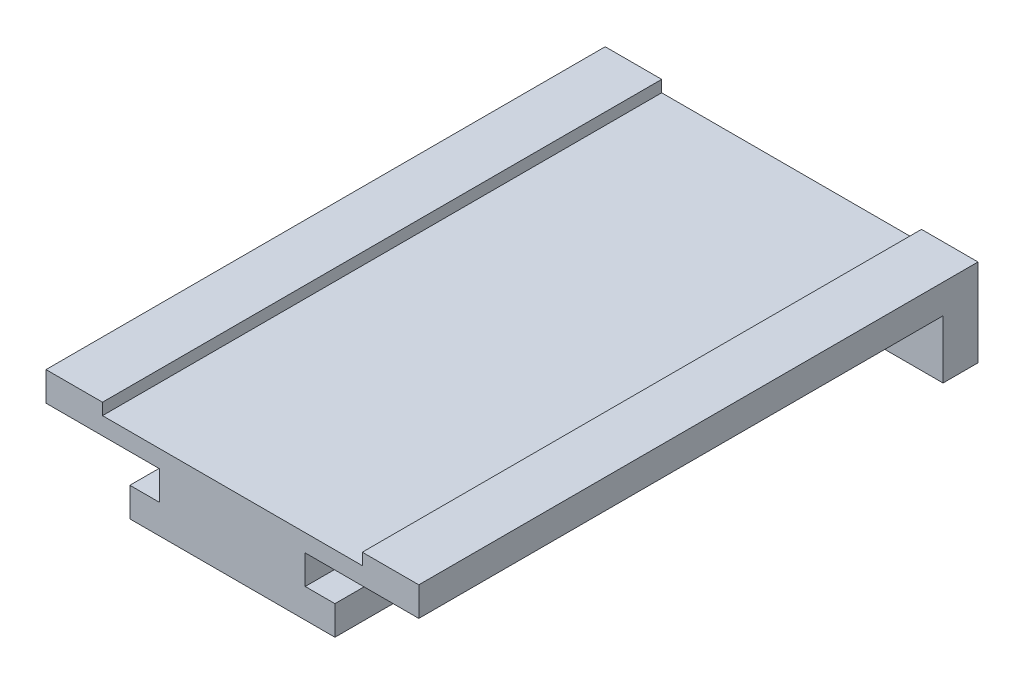
ISO-10303-21;
HEADER;
FILE_DESCRIPTION(('STEP AP214'),'2;1');
FILE_NAME('part.step','',(''),(''),'','','');
FILE_SCHEMA(('AUTOMOTIVE_DESIGN { 1 0 10303 214 1 1 1 1 }'));
ENDSEC;
DATA;
#1=APPLICATION_CONTEXT('core data for automotive mechanical design processes');
#2=APPLICATION_PROTOCOL_DEFINITION('international standard','automotive_design',2000,#1);
#3=PRODUCT_CONTEXT('',#1,'mechanical');
#4=PRODUCT('Part','Part','',(#3));
#5=PRODUCT_RELATED_PRODUCT_CATEGORY('part','',(#4));
#6=PRODUCT_DEFINITION_FORMATION('','',#4);
#7=PRODUCT_DEFINITION_CONTEXT('part definition',#1,'design');
#8=PRODUCT_DEFINITION('design','',#6,#7);
#9=PRODUCT_DEFINITION_SHAPE('','',#8);
#10=(LENGTH_UNIT() NAMED_UNIT(*) SI_UNIT(.MILLI.,.METRE.));
#11=(NAMED_UNIT(*) PLANE_ANGLE_UNIT() SI_UNIT($,.RADIAN.));
#12=(NAMED_UNIT(*) SI_UNIT($,.STERADIAN.) SOLID_ANGLE_UNIT());
#13=UNCERTAINTY_MEASURE_WITH_UNIT(LENGTH_MEASURE(1.E-05),#10,'distance_accuracy_value','');
#14=(GEOMETRIC_REPRESENTATION_CONTEXT(3) GLOBAL_UNCERTAINTY_ASSIGNED_CONTEXT((#13)) GLOBAL_UNIT_ASSIGNED_CONTEXT((#10,
#11,#12)) REPRESENTATION_CONTEXT('',''));
#15=CARTESIAN_POINT('',(0.,0.,0.));
#16=DIRECTION('',(0.,0.,1.));
#17=DIRECTION('',(1.,0.,0.));
#18=AXIS2_PLACEMENT_3D('',#15,#16,#17);
#19=CARTESIAN_POINT('',(0.,2.78985507246377,45.));
#20=DIRECTION('',(0.,1.,0.));
#21=DIRECTION('',(0.,0.,1.));
#22=AXIS2_PLACEMENT_3D('',#19,#20,#21);
#23=PLANE('',#22);
#24=DIRECTION('',(1.,0.,0.));
#25=VECTOR('',#24,1.);
#26=CARTESIAN_POINT('',(12.7971014492753,2.78985507246377,-3.));
#27=LINE('',#26,#25);
#28=CARTESIAN_POINT('',(7.94710144927535,2.78985507246377,-3.));
#29=VERTEX_POINT('',#28);
#30=CARTESIAN_POINT('',(12.7971014492753,2.78985507246377,-3.));
#31=VERTEX_POINT('',#30);
#32=EDGE_CURVE('E169',#29,#31,#27,.T.);
#33=ORIENTED_EDGE('',*,*,#32,.F.);
#34=DIRECTION('',(0.,0.,1.));
#35=VECTOR('',#34,1.);
#36=CARTESIAN_POINT('',(7.94710144927535,2.78985507246377,0.));
#37=LINE('',#36,#35);
#38=CARTESIAN_POINT('',(7.94710144927535,2.78985507246377,45.));
#39=VERTEX_POINT('',#38);
#40=EDGE_CURVE('E324',#29,#39,#37,.T.);
#41=ORIENTED_EDGE('',*,*,#40,.T.);
#42=DIRECTION('',(1.,0.,0.));
#43=VECTOR('',#42,1.);
#44=CARTESIAN_POINT('',(0.,2.78985507246377,45.));
#45=LINE('',#44,#43);
#46=CARTESIAN_POINT('',(12.7971014492753,2.78985507246377,45.));
#47=VERTEX_POINT('',#46);
#48=EDGE_CURVE('E171',#39,#47,#45,.T.);
#49=ORIENTED_EDGE('',*,*,#48,.T.);
#50=DIRECTION('',(0.,0.,-1.));
#51=VECTOR('',#50,1.);
#52=CARTESIAN_POINT('',(12.7971014492753,2.78985507246377,45.));
#53=LINE('',#52,#51);
#54=EDGE_CURVE('E49',#47,#31,#53,.T.);
#55=ORIENTED_EDGE('',*,*,#54,.T.);
#56=EDGE_LOOP('',(#33,#41,#49,#55));
#57=FACE_BOUND('',#56,.T.);
#58=ADVANCED_FACE('F40',(#57),#23,.T.);
#59=CARTESIAN_POINT('',(0.,0.289855072463773,45.));
#60=DIRECTION('',(0.,1.,0.));
#61=DIRECTION('',(0.,0.,1.));
#62=AXIS2_PLACEMENT_3D('',#59,#60,#61);
#63=PLANE('',#62);
#64=DIRECTION('',(1.,0.,0.));
#65=VECTOR('',#64,1.);
#66=CARTESIAN_POINT('',(0.,0.289855072463773,0.));
#67=LINE('',#66,#65);
#68=CARTESIAN_POINT('',(3.04710144927535,0.289855072463773,0.));
#69=VERTEX_POINT('',#68);
#70=CARTESIAN_POINT('',(12.7971014492753,0.289855072463773,0.));
#71=VERTEX_POINT('',#70);
#72=EDGE_CURVE('E141',#69,#71,#67,.T.);
#73=ORIENTED_EDGE('',*,*,#72,.T.);
#74=DIRECTION('',(0.,0.,-1.));
#75=VECTOR('',#74,1.);
#76=CARTESIAN_POINT('',(12.7971014492753,0.289855072463773,45.));
#77=LINE('',#76,#75);
#78=CARTESIAN_POINT('',(12.7971014492753,0.289855072463773,45.));
#79=VERTEX_POINT('',#78);
#80=EDGE_CURVE('E11',#79,#71,#77,.T.);
#81=ORIENTED_EDGE('',*,*,#80,.F.);
#82=DIRECTION('',(1.,0.,0.));
#83=VECTOR('',#82,1.);
#84=CARTESIAN_POINT('',(0.,0.289855072463773,45.));
#85=LINE('',#84,#83);
#86=CARTESIAN_POINT('',(3.04710144927535,0.289855072463773,45.));
#87=VERTEX_POINT('',#86);
#88=EDGE_CURVE('E154',#87,#79,#85,.T.);
#89=ORIENTED_EDGE('',*,*,#88,.F.);
#90=DIRECTION('',(0.,0.,-1.));
#91=VECTOR('',#90,1.);
#92=CARTESIAN_POINT('',(3.04710144927535,0.289855072463773,45.));
#93=LINE('',#92,#91);
#94=EDGE_CURVE('E65',#87,#69,#93,.T.);
#95=ORIENTED_EDGE('',*,*,#94,.T.);
#96=EDGE_LOOP('',(#73,#81,#89,#95));
#97=FACE_BOUND('',#96,.T.);
#98=ADVANCED_FACE('F42',(#97),#63,.F.);
#99=CARTESIAN_POINT('',(12.7971014492753,0.,45.));
#100=DIRECTION('',(-1.,0.,0.));
#101=DIRECTION('',(0.,0.,1.));
#102=AXIS2_PLACEMENT_3D('',#99,#100,#101);
#103=PLANE('',#102);
#104=ORIENTED_EDGE('',*,*,#80,.T.);
#105=DIRECTION('',(0.,-1.,0.));
#106=VECTOR('',#105,1.);
#107=CARTESIAN_POINT('',(12.7971014492753,2.78985507246377,0.));
#108=LINE('',#107,#106);
#109=CARTESIAN_POINT('',(12.7971014492753,-4.71014492753623,0.));
#110=VERTEX_POINT('',#109);
#111=EDGE_CURVE('E208',#71,#110,#108,.T.);
#112=ORIENTED_EDGE('',*,*,#111,.T.);
#113=DIRECTION('',(0.,0.,1.));
#114=VECTOR('',#113,1.);
#115=CARTESIAN_POINT('',(12.7971014492753,-4.71014492753623,-3.));
#116=LINE('',#115,#114);
#117=CARTESIAN_POINT('',(12.7971014492753,-4.71014492753623,-3.));
#118=VERTEX_POINT('',#117);
#119=EDGE_CURVE('E182',#118,#110,#116,.T.);
#120=ORIENTED_EDGE('',*,*,#119,.F.);
#121=DIRECTION('',(0.,-1.,0.));
#122=VECTOR('',#121,1.);
#123=CARTESIAN_POINT('',(12.7971014492753,2.78985507246377,-3.));
#124=LINE('',#123,#122);
#125=EDGE_CURVE('E177',#31,#118,#124,.T.);
#126=ORIENTED_EDGE('',*,*,#125,.F.);
#127=ORIENTED_EDGE('',*,*,#54,.F.);
#128=DIRECTION('',(0.,1.,0.));
#129=VECTOR('',#128,1.);
#130=CARTESIAN_POINT('',(12.7971014492753,0.,45.));
#131=LINE('',#130,#129);
#132=EDGE_CURVE('E93',#79,#47,#131,.T.);
#133=ORIENTED_EDGE('',*,*,#132,.F.);
#134=EDGE_LOOP('',(#104,#112,#120,#126,#127,#133));
#135=FACE_BOUND('',#134,.T.);
#136=ADVANCED_FACE('F178',(#135),#103,.F.);
#137=DIRECTION('',(0.,0.,1.));
#138=VECTOR('',#137,1.);
#139=CARTESIAN_POINT('',(-14.3528985507247,2.78985507246377,0.));
#140=LINE('',#139,#138);
#141=CARTESIAN_POINT('',(-14.3528985507247,2.78985507246377,-3.));
#142=VERTEX_POINT('',#141);
#143=CARTESIAN_POINT('',(-14.3528985507247,2.78985507246377,45.));
#144=VERTEX_POINT('',#143);
#145=EDGE_CURVE('E319',#142,#144,#140,.T.);
#146=ORIENTED_EDGE('',*,*,#145,.F.);
#147=CARTESIAN_POINT('',(-19.2028985507247,2.78985507246377,-3.));
#148=VERTEX_POINT('',#147);
#149=EDGE_CURVE('E203',#148,#142,#27,.T.);
#150=ORIENTED_EDGE('',*,*,#149,.F.);
#151=DIRECTION('',(0.,0.,-1.));
#152=VECTOR('',#151,1.);
#153=CARTESIAN_POINT('',(-19.2028985507247,2.78985507246377,45.));
#154=LINE('',#153,#152);
#155=CARTESIAN_POINT('',(-19.2028985507247,2.78985507246377,45.));
#156=VERTEX_POINT('',#155);
#157=EDGE_CURVE('E268',#156,#148,#154,.T.);
#158=ORIENTED_EDGE('',*,*,#157,.F.);
#159=EDGE_CURVE('E291',#156,#144,#45,.T.);
#160=ORIENTED_EDGE('',*,*,#159,.T.);
#161=EDGE_LOOP('',(#146,#150,#158,#160));
#162=FACE_BOUND('',#161,.T.);
#163=ADVANCED_FACE('F411',(#162),#23,.T.);
#164=CARTESIAN_POINT('',(0.,-4.71014492753623,45.));
#165=DIRECTION('',(0.,1.,0.));
#166=DIRECTION('',(0.,0.,1.));
#167=AXIS2_PLACEMENT_3D('',#164,#165,#166);
#168=PLANE('',#167);
#169=CARTESIAN_POINT('',(-3.20289855072465,-4.71014492753623,32.5));
#170=DIRECTION('',(0.,-1.,0.));
#171=DIRECTION('',(0.,0.,-1.));
#172=AXIS2_PLACEMENT_3D('',#169,#170,#171);
#173=CIRCLE('',#172,1.5);
#174=CARTESIAN_POINT('',(-3.20289855072465,-4.71014492753623,31.));
#175=VERTEX_POINT('',#174);
#176=EDGE_CURVE('E222',#175,#175,#173,.T.);
#177=ORIENTED_EDGE('',*,*,#176,.F.);
#178=EDGE_LOOP('',(#177));
#179=FACE_BOUND('',#178,.T.);
#180=CARTESIAN_POINT('',(-3.20289855072465,-4.71014492753623,12.5));
#181=DIRECTION('',(0.,-1.,0.));
#182=DIRECTION('',(0.,0.,1.));
#183=AXIS2_PLACEMENT_3D('',#180,#181,#182);
#184=CIRCLE('',#183,1.5);
#185=CARTESIAN_POINT('',(-3.20289855072465,-4.71014492753623,14.));
#186=VERTEX_POINT('',#185);
#187=EDGE_CURVE('E221',#186,#186,#184,.T.);
#188=ORIENTED_EDGE('',*,*,#187,.F.);
#189=EDGE_LOOP('',(#188));
#190=FACE_BOUND('',#189,.T.);
#191=DIRECTION('',(0.,0.,-1.));
#192=VECTOR('',#191,1.);
#193=CARTESIAN_POINT('',(-12.0028985507247,-4.71014492753623,45.));
#194=LINE('',#193,#192);
#195=CARTESIAN_POINT('',(-12.0028985507247,-4.71014492753623,45.));
#196=VERTEX_POINT('',#195);
#197=CARTESIAN_POINT('',(-12.0028985507247,-4.71014492753623,0.));
#198=VERTEX_POINT('',#197);
#199=EDGE_CURVE('E272',#196,#198,#194,.T.);
#200=ORIENTED_EDGE('',*,*,#199,.T.);
#201=DIRECTION('',(-1.,0.,0.));
#202=VECTOR('',#201,1.);
#203=CARTESIAN_POINT('',(12.7971014492753,-4.71014492753623,0.));
#204=LINE('',#203,#202);
#205=CARTESIAN_POINT('',(-19.2028985507247,-4.71014492753623,0.));
#206=VERTEX_POINT('',#205);
#207=EDGE_CURVE('E211',#198,#206,#204,.T.);
#208=ORIENTED_EDGE('',*,*,#207,.T.);
#209=DIRECTION('',(0.,0.,1.));
#210=VECTOR('',#209,1.);
#211=CARTESIAN_POINT('',(-19.2028985507247,-4.71014492753623,-3.));
#212=LINE('',#211,#210);
#213=CARTESIAN_POINT('',(-19.2028985507247,-4.71014492753623,-3.));
#214=VERTEX_POINT('',#213);
#215=EDGE_CURVE('E207',#214,#206,#212,.T.);
#216=ORIENTED_EDGE('',*,*,#215,.F.);
#217=DIRECTION('',(-1.,0.,0.));
#218=VECTOR('',#217,1.);
#219=CARTESIAN_POINT('',(12.7971014492753,-4.71014492753623,-3.));
#220=LINE('',#219,#218);
#221=EDGE_CURVE('E186',#118,#214,#220,.T.);
#222=ORIENTED_EDGE('',*,*,#221,.F.);
#223=ORIENTED_EDGE('',*,*,#119,.T.);
#224=CARTESIAN_POINT('',(5.59710144927535,-4.71014492753623,0.));
#225=VERTEX_POINT('',#224);
#226=EDGE_CURVE('E194',#110,#225,#204,.T.);
#227=ORIENTED_EDGE('',*,*,#226,.T.);
#228=DIRECTION('',(0.,0.,-1.));
#229=VECTOR('',#228,1.);
#230=CARTESIAN_POINT('',(5.59710144927535,-4.71014492753623,45.));
#231=LINE('',#230,#229);
#232=CARTESIAN_POINT('',(5.59710144927535,-4.71014492753623,45.));
#233=VERTEX_POINT('',#232);
#234=EDGE_CURVE('E118',#233,#225,#231,.T.);
#235=ORIENTED_EDGE('',*,*,#234,.F.);
#236=DIRECTION('',(1.,0.,0.));
#237=VECTOR('',#236,1.);
#238=CARTESIAN_POINT('',(0.,-4.71014492753623,45.));
#239=LINE('',#238,#237);
#240=EDGE_CURVE('E129',#196,#233,#239,.T.);
#241=ORIENTED_EDGE('',*,*,#240,.F.);
#242=EDGE_LOOP('',(#200,#208,#216,#222,#223,#227,#235,#241));
#243=FACE_BOUND('',#242,.T.);
#244=ADVANCED_FACE('F391',(#179,#190,#243),#168,.F.);
#245=CARTESIAN_POINT('',(5.59710144927535,0.,45.));
#246=DIRECTION('',(1.,0.,0.));
#247=DIRECTION('',(0.,1.,0.));
#248=AXIS2_PLACEMENT_3D('',#245,#246,#247);
#249=PLANE('',#248);
#250=DIRECTION('',(0.,-1.,0.));
#251=VECTOR('',#250,1.);
#252=CARTESIAN_POINT('',(5.59710144927535,0.,0.));
#253=LINE('',#252,#251);
#254=CARTESIAN_POINT('',(5.59710144927535,-2.21014492753623,0.));
#255=VERTEX_POINT('',#254);
#256=EDGE_CURVE('E112',#255,#225,#253,.T.);
#257=ORIENTED_EDGE('',*,*,#256,.F.);
#258=DIRECTION('',(0.,0.,-1.));
#259=VECTOR('',#258,1.);
#260=CARTESIAN_POINT('',(5.59710144927535,-2.21014492753623,45.));
#261=LINE('',#260,#259);
#262=CARTESIAN_POINT('',(5.59710144927535,-2.21014492753623,45.));
#263=VERTEX_POINT('',#262);
#264=EDGE_CURVE('E107',#263,#255,#261,.T.);
#265=ORIENTED_EDGE('',*,*,#264,.F.);
#266=DIRECTION('',(0.,-1.,0.));
#267=VECTOR('',#266,1.);
#268=CARTESIAN_POINT('',(5.59710144927535,0.,45.));
#269=LINE('',#268,#267);
#270=EDGE_CURVE('E110',#263,#233,#269,.T.);
#271=ORIENTED_EDGE('',*,*,#270,.T.);
#272=ORIENTED_EDGE('',*,*,#234,.T.);
#273=EDGE_LOOP('',(#257,#265,#271,#272));
#274=FACE_BOUND('',#273,.T.);
#275=ADVANCED_FACE('F109',(#274),#249,.T.);
#276=CARTESIAN_POINT('',(0.,-2.21014492753623,45.));
#277=DIRECTION('',(0.,1.,0.));
#278=DIRECTION('',(0.,0.,1.));
#279=AXIS2_PLACEMENT_3D('',#276,#277,#278);
#280=PLANE('',#279);
#281=DIRECTION('',(1.,0.,0.));
#282=VECTOR('',#281,1.);
#283=CARTESIAN_POINT('',(0.,-2.21014492753623,0.));
#284=LINE('',#283,#282);
#285=CARTESIAN_POINT('',(3.04710144927535,-2.21014492753623,0.));
#286=VERTEX_POINT('',#285);
#287=EDGE_CURVE('E147',#286,#255,#284,.T.);
#288=ORIENTED_EDGE('',*,*,#287,.F.);
#289=DIRECTION('',(0.,0.,-1.));
#290=VECTOR('',#289,1.);
#291=CARTESIAN_POINT('',(3.04710144927535,-2.21014492753623,45.));
#292=LINE('',#291,#290);
#293=CARTESIAN_POINT('',(3.04710144927535,-2.21014492753623,45.));
#294=VERTEX_POINT('',#293);
#295=EDGE_CURVE('E119',#294,#286,#292,.T.);
#296=ORIENTED_EDGE('',*,*,#295,.F.);
#297=DIRECTION('',(1.,0.,0.));
#298=VECTOR('',#297,1.);
#299=CARTESIAN_POINT('',(0.,-2.21014492753623,45.));
#300=LINE('',#299,#298);
#301=EDGE_CURVE('E126',#294,#263,#300,.T.);
#302=ORIENTED_EDGE('',*,*,#301,.T.);
#303=ORIENTED_EDGE('',*,*,#264,.T.);
#304=EDGE_LOOP('',(#288,#296,#302,#303));
#305=FACE_BOUND('',#304,.T.);
#306=ADVANCED_FACE('F133',(#305),#280,.T.);
#307=CARTESIAN_POINT('',(3.04710144927535,0.,45.));
#308=DIRECTION('',(1.,0.,0.));
#309=DIRECTION('',(0.,0.,-1.));
#310=AXIS2_PLACEMENT_3D('',#307,#308,#309);
#311=PLANE('',#310);
#312=DIRECTION('',(0.,-1.,0.));
#313=VECTOR('',#312,1.);
#314=CARTESIAN_POINT('',(3.04710144927535,0.,0.));
#315=LINE('',#314,#313);
#316=EDGE_CURVE('E150',#69,#286,#315,.T.);
#317=ORIENTED_EDGE('',*,*,#316,.F.);
#318=ORIENTED_EDGE('',*,*,#94,.F.);
#319=DIRECTION('',(0.,-1.,0.));
#320=VECTOR('',#319,1.);
#321=CARTESIAN_POINT('',(3.04710144927535,0.,45.));
#322=LINE('',#321,#320);
#323=EDGE_CURVE('E135',#87,#294,#322,.T.);
#324=ORIENTED_EDGE('',*,*,#323,.T.);
#325=ORIENTED_EDGE('',*,*,#295,.T.);
#326=EDGE_LOOP('',(#317,#318,#324,#325));
#327=FACE_BOUND('',#326,.T.);
#328=ADVANCED_FACE('F472',(#327),#311,.T.);
#329=CARTESIAN_POINT('',(0.,0.,45.));
#330=DIRECTION('',(0.,0.,1.));
#331=DIRECTION('',(1.,0.,0.));
#332=AXIS2_PLACEMENT_3D('',#329,#330,#331);
#333=PLANE('',#332);
#334=DIRECTION('',(0.,1.,0.));
#335=VECTOR('',#334,1.);
#336=CARTESIAN_POINT('',(-14.3528985507247,1.78985507246377,45.));
#337=LINE('',#336,#335);
#338=CARTESIAN_POINT('',(-14.3528985507247,1.78985507246377,45.));
#339=VERTEX_POINT('',#338);
#340=EDGE_CURVE('E212',#339,#144,#337,.T.);
#341=ORIENTED_EDGE('',*,*,#340,.T.);
#342=ORIENTED_EDGE('',*,*,#159,.F.);
#343=DIRECTION('',(0.,1.,0.));
#344=VECTOR('',#343,1.);
#345=CARTESIAN_POINT('',(-19.2028985507247,0.,45.));
#346=LINE('',#345,#344);
#347=CARTESIAN_POINT('',(-19.2028985507247,0.289855072463773,45.));
#348=VERTEX_POINT('',#347);
#349=EDGE_CURVE('E246',#348,#156,#346,.T.);
#350=ORIENTED_EDGE('',*,*,#349,.F.);
#351=DIRECTION('',(-1.,0.,0.));
#352=VECTOR('',#351,1.);
#353=CARTESIAN_POINT('',(-6.4057971014493,0.289855072463773,45.));
#354=LINE('',#353,#352);
#355=CARTESIAN_POINT('',(-9.45289855072465,0.289855072463773,45.));
#356=VERTEX_POINT('',#355);
#357=EDGE_CURVE('E230',#356,#348,#354,.T.);
#358=ORIENTED_EDGE('',*,*,#357,.F.);
#359=DIRECTION('',(0.,-1.,0.));
#360=VECTOR('',#359,1.);
#361=CARTESIAN_POINT('',(-9.45289855072465,0.,45.));
#362=LINE('',#361,#360);
#363=CARTESIAN_POINT('',(-9.45289855072465,-2.21014492753623,45.));
#364=VERTEX_POINT('',#363);
#365=EDGE_CURVE('E234',#356,#364,#362,.T.);
#366=ORIENTED_EDGE('',*,*,#365,.T.);
#367=DIRECTION('',(-1.,0.,0.));
#368=VECTOR('',#367,1.);
#369=CARTESIAN_POINT('',(-6.4057971014493,-2.21014492753623,45.));
#370=LINE('',#369,#368);
#371=CARTESIAN_POINT('',(-12.0028985507247,-2.21014492753623,45.));
#372=VERTEX_POINT('',#371);
#373=EDGE_CURVE('E239',#364,#372,#370,.T.);
#374=ORIENTED_EDGE('',*,*,#373,.T.);
#375=DIRECTION('',(0.,-1.,0.));
#376=VECTOR('',#375,1.);
#377=CARTESIAN_POINT('',(-12.0028985507246,0.,45.));
#378=LINE('',#377,#376);
#379=EDGE_CURVE('E243',#372,#196,#378,.T.);
#380=ORIENTED_EDGE('',*,*,#379,.T.);
#381=ORIENTED_EDGE('',*,*,#240,.T.);
#382=ORIENTED_EDGE('',*,*,#270,.F.);
#383=ORIENTED_EDGE('',*,*,#301,.F.);
#384=ORIENTED_EDGE('',*,*,#323,.F.);
#385=ORIENTED_EDGE('',*,*,#88,.T.);
#386=ORIENTED_EDGE('',*,*,#132,.T.);
#387=ORIENTED_EDGE('',*,*,#48,.F.);
#388=DIRECTION('',(0.,1.,0.));
#389=VECTOR('',#388,1.);
#390=CARTESIAN_POINT('',(7.94710144927535,1.78985507246377,45.));
#391=LINE('',#390,#389);
#392=CARTESIAN_POINT('',(7.94710144927535,1.78985507246377,45.));
#393=VERTEX_POINT('',#392);
#394=EDGE_CURVE('E197',#393,#39,#391,.T.);
#395=ORIENTED_EDGE('',*,*,#394,.F.);
#396=DIRECTION('',(1.,0.,0.));
#397=VECTOR('',#396,1.);
#398=CARTESIAN_POINT('',(0.,1.78985507246377,45.));
#399=LINE('',#398,#397);
#400=EDGE_CURVE('E323',#339,#393,#399,.T.);
#401=ORIENTED_EDGE('',*,*,#400,.F.);
#402=EDGE_LOOP('',(#341,#342,#350,#358,#366,#374,#380,#381,#382,#383,#384,#385,#386,#387,#395,#401));
#403=FACE_BOUND('',#402,.T.);
#404=ADVANCED_FACE('F124',(#403),#333,.T.);
#405=CARTESIAN_POINT('',(-6.4057971014493,0.289855072463773,45.));
#406=DIRECTION('',(0.,-1.,0.));
#407=DIRECTION('',(0.,0.,-1.));
#408=AXIS2_PLACEMENT_3D('',#405,#406,#407);
#409=PLANE('',#408);
#410=DIRECTION('',(-1.,0.,0.));
#411=VECTOR('',#410,1.);
#412=CARTESIAN_POINT('',(-6.4057971014493,0.289855072463773,0.));
#413=LINE('',#412,#411);
#414=CARTESIAN_POINT('',(-9.45289855072465,0.289855072463773,0.));
#415=VERTEX_POINT('',#414);
#416=CARTESIAN_POINT('',(-19.2028985507247,0.289855072463773,0.));
#417=VERTEX_POINT('',#416);
#418=EDGE_CURVE('E226',#415,#417,#413,.T.);
#419=ORIENTED_EDGE('',*,*,#418,.F.);
#420=DIRECTION('',(0.,0.,-1.));
#421=VECTOR('',#420,1.);
#422=CARTESIAN_POINT('',(-9.45289855072465,0.289855072463773,45.));
#423=LINE('',#422,#421);
#424=EDGE_CURVE('E144',#356,#415,#423,.T.);
#425=ORIENTED_EDGE('',*,*,#424,.F.);
#426=ORIENTED_EDGE('',*,*,#357,.T.);
#427=DIRECTION('',(0.,0.,-1.));
#428=VECTOR('',#427,1.);
#429=CARTESIAN_POINT('',(-19.2028985507247,0.289855072463773,45.));
#430=LINE('',#429,#428);
#431=EDGE_CURVE('E250',#348,#417,#430,.T.);
#432=ORIENTED_EDGE('',*,*,#431,.T.);
#433=EDGE_LOOP('',(#419,#425,#426,#432));
#434=FACE_BOUND('',#433,.T.);
#435=ADVANCED_FACE('F420',(#434),#409,.T.);
#436=CARTESIAN_POINT('',(-9.45289855072465,0.,45.));
#437=DIRECTION('',(1.,0.,0.));
#438=DIRECTION('',(0.,0.,-1.));
#439=AXIS2_PLACEMENT_3D('',#436,#437,#438);
#440=PLANE('',#439);
#441=DIRECTION('',(0.,-1.,0.));
#442=VECTOR('',#441,1.);
#443=CARTESIAN_POINT('',(-9.45289855072465,0.,0.));
#444=LINE('',#443,#442);
#445=CARTESIAN_POINT('',(-9.45289855072465,-2.21014492753623,0.));
#446=VERTEX_POINT('',#445);
#447=EDGE_CURVE('E254',#415,#446,#444,.T.);
#448=ORIENTED_EDGE('',*,*,#447,.T.);
#449=DIRECTION('',(0.,0.,-1.));
#450=VECTOR('',#449,1.);
#451=CARTESIAN_POINT('',(-9.45289855072465,-2.21014492753623,45.));
#452=LINE('',#451,#450);
#453=EDGE_CURVE('E280',#364,#446,#452,.T.);
#454=ORIENTED_EDGE('',*,*,#453,.F.);
#455=ORIENTED_EDGE('',*,*,#365,.F.);
#456=ORIENTED_EDGE('',*,*,#424,.T.);
#457=EDGE_LOOP('',(#448,#454,#455,#456));
#458=FACE_BOUND('',#457,.T.);
#459=ADVANCED_FACE('F422',(#458),#440,.F.);
#460=CARTESIAN_POINT('',(-6.4057971014493,-2.21014492753623,45.));
#461=DIRECTION('',(0.,-1.,0.));
#462=DIRECTION('',(0.,0.,-1.));
#463=AXIS2_PLACEMENT_3D('',#460,#461,#462);
#464=PLANE('',#463);
#465=DIRECTION('',(-1.,0.,0.));
#466=VECTOR('',#465,1.);
#467=CARTESIAN_POINT('',(-6.4057971014493,-2.21014492753623,0.));
#468=LINE('',#467,#466);
#469=CARTESIAN_POINT('',(-12.0028985507247,-2.21014492753623,0.));
#470=VERTEX_POINT('',#469);
#471=EDGE_CURVE('E258',#446,#470,#468,.T.);
#472=ORIENTED_EDGE('',*,*,#471,.T.);
#473=DIRECTION('',(0.,0.,-1.));
#474=VECTOR('',#473,1.);
#475=CARTESIAN_POINT('',(-12.0028985507247,-2.21014492753623,45.));
#476=LINE('',#475,#474);
#477=EDGE_CURVE('E276',#372,#470,#476,.T.);
#478=ORIENTED_EDGE('',*,*,#477,.F.);
#479=ORIENTED_EDGE('',*,*,#373,.F.);
#480=ORIENTED_EDGE('',*,*,#453,.T.);
#481=EDGE_LOOP('',(#472,#478,#479,#480));
#482=FACE_BOUND('',#481,.T.);
#483=ADVANCED_FACE('F424',(#482),#464,.F.);
#484=CARTESIAN_POINT('',(-12.0028985507246,0.,45.));
#485=DIRECTION('',(1.,0.,0.));
#486=DIRECTION('',(0.,1.,0.));
#487=AXIS2_PLACEMENT_3D('',#484,#485,#486);
#488=PLANE('',#487);
#489=DIRECTION('',(0.,-1.,0.));
#490=VECTOR('',#489,1.);
#491=CARTESIAN_POINT('',(-12.0028985507246,0.,0.));
#492=LINE('',#491,#490);
#493=EDGE_CURVE('E235',#470,#198,#492,.T.);
#494=ORIENTED_EDGE('',*,*,#493,.T.);
#495=ORIENTED_EDGE('',*,*,#199,.F.);
#496=ORIENTED_EDGE('',*,*,#379,.F.);
#497=ORIENTED_EDGE('',*,*,#477,.T.);
#498=EDGE_LOOP('',(#494,#495,#496,#497));
#499=FACE_BOUND('',#498,.T.);
#500=ADVANCED_FACE('F397',(#499),#488,.F.);
#501=CARTESIAN_POINT('',(-19.2028985507247,0.,45.));
#502=DIRECTION('',(-1.,0.,0.));
#503=DIRECTION('',(0.,0.,1.));
#504=AXIS2_PLACEMENT_3D('',#501,#502,#503);
#505=PLANE('',#504);
#506=ORIENTED_EDGE('',*,*,#157,.T.);
#507=DIRECTION('',(0.,1.,0.));
#508=VECTOR('',#507,1.);
#509=CARTESIAN_POINT('',(-19.2028985507247,2.78985507246377,-3.));
#510=LINE('',#509,#508);
#511=EDGE_CURVE('E191',#214,#148,#510,.T.);
#512=ORIENTED_EDGE('',*,*,#511,.F.);
#513=ORIENTED_EDGE('',*,*,#215,.T.);
#514=DIRECTION('',(0.,1.,0.));
#515=VECTOR('',#514,1.);
#516=CARTESIAN_POINT('',(-19.2028985507247,2.78985507246377,0.));
#517=LINE('',#516,#515);
#518=EDGE_CURVE('E187',#206,#417,#517,.T.);
#519=ORIENTED_EDGE('',*,*,#518,.T.);
#520=ORIENTED_EDGE('',*,*,#431,.F.);
#521=ORIENTED_EDGE('',*,*,#349,.T.);
#522=EDGE_LOOP('',(#506,#512,#513,#519,#520,#521));
#523=FACE_BOUND('',#522,.T.);
#524=ADVANCED_FACE('F405',(#523),#505,.T.);
#525=CARTESIAN_POINT('',(-3.20289855072465,-4.71014492753623,12.5));
#526=DIRECTION('',(0.,-1.,0.));
#527=DIRECTION('',(0.,0.,1.));
#528=AXIS2_PLACEMENT_3D('',#525,#526,#527);
#529=CONICAL_SURFACE('',#528,1.5,0.78539816339745);
#530=CARTESIAN_POINT('',(-3.20289855072465,-3.21014492753623,12.5));
#531=VERTEX_POINT('',#530);
#532=VERTEX_LOOP('',#531);
#533=FACE_BOUND('',#532,.T.);
#534=ORIENTED_EDGE('',*,*,#187,.T.);
#535=EDGE_LOOP('',(#534));
#536=FACE_BOUND('',#535,.T.);
#537=ADVANCED_FACE('F520',(#533,#536),#529,.F.);
#538=CARTESIAN_POINT('',(-3.20289855072465,-4.71014492753623,32.5));
#539=DIRECTION('',(0.,-1.,0.));
#540=DIRECTION('',(0.,0.,-1.));
#541=AXIS2_PLACEMENT_3D('',#538,#539,#540);
#542=CONICAL_SURFACE('',#541,1.5,0.78539816339745);
#543=CARTESIAN_POINT('',(-3.20289855072465,-3.21014492753623,32.5));
#544=VERTEX_POINT('',#543);
#545=VERTEX_LOOP('',#544);
#546=FACE_BOUND('',#545,.T.);
#547=ORIENTED_EDGE('',*,*,#176,.T.);
#548=EDGE_LOOP('',(#547));
#549=FACE_BOUND('',#548,.T.);
#550=ADVANCED_FACE('F530',(#546,#549),#542,.F.);
#551=CARTESIAN_POINT('',(0.,0.,0.));
#552=DIRECTION('',(0.,0.,-1.));
#553=DIRECTION('',(-1.,0.,0.));
#554=AXIS2_PLACEMENT_3D('',#551,#552,#553);
#555=PLANE('',#554);
#556=ORIENTED_EDGE('',*,*,#72,.F.);
#557=ORIENTED_EDGE('',*,*,#316,.T.);
#558=ORIENTED_EDGE('',*,*,#287,.T.);
#559=ORIENTED_EDGE('',*,*,#256,.T.);
#560=ORIENTED_EDGE('',*,*,#226,.F.);
#561=ORIENTED_EDGE('',*,*,#111,.F.);
#562=EDGE_LOOP('',(#556,#557,#558,#559,#560,#561));
#563=FACE_BOUND('',#562,.T.);
#564=ADVANCED_FACE('F527',(#563),#555,.F.);
#565=CARTESIAN_POINT('',(0.,0.,-3.));
#566=DIRECTION('',(0.,0.,-1.));
#567=DIRECTION('',(-1.,0.,0.));
#568=AXIS2_PLACEMENT_3D('',#565,#566,#567);
#569=PLANE('',#568);
#570=DIRECTION('',(0.,1.,0.));
#571=VECTOR('',#570,1.);
#572=CARTESIAN_POINT('',(-14.3528985507247,1.78985507246377,-3.));
#573=LINE('',#572,#571);
#574=CARTESIAN_POINT('',(-14.3528985507247,1.78985507246377,-3.));
#575=VERTEX_POINT('',#574);
#576=EDGE_CURVE('E309',#575,#142,#573,.T.);
#577=ORIENTED_EDGE('',*,*,#576,.F.);
#578=DIRECTION('',(-1.,0.,0.));
#579=VECTOR('',#578,1.);
#580=CARTESIAN_POINT('',(0.,1.78985507246377,-3.));
#581=LINE('',#580,#579);
#582=CARTESIAN_POINT('',(7.94710144927535,1.78985507246377,-3.));
#583=VERTEX_POINT('',#582);
#584=EDGE_CURVE('E302',#583,#575,#581,.T.);
#585=ORIENTED_EDGE('',*,*,#584,.F.);
#586=DIRECTION('',(0.,1.,0.));
#587=VECTOR('',#586,1.);
#588=CARTESIAN_POINT('',(7.94710144927535,1.78985507246377,-3.));
#589=LINE('',#588,#587);
#590=EDGE_CURVE('E301',#583,#29,#589,.T.);
#591=ORIENTED_EDGE('',*,*,#590,.T.);
#592=ORIENTED_EDGE('',*,*,#32,.T.);
#593=ORIENTED_EDGE('',*,*,#125,.T.);
#594=ORIENTED_EDGE('',*,*,#221,.T.);
#595=ORIENTED_EDGE('',*,*,#511,.T.);
#596=ORIENTED_EDGE('',*,*,#149,.T.);
#597=EDGE_LOOP('',(#577,#585,#591,#592,#593,#594,#595,#596));
#598=FACE_BOUND('',#597,.T.);
#599=ADVANCED_FACE('F299',(#598),#569,.T.);
#600=ORIENTED_EDGE('',*,*,#493,.F.);
#601=ORIENTED_EDGE('',*,*,#471,.F.);
#602=ORIENTED_EDGE('',*,*,#447,.F.);
#603=ORIENTED_EDGE('',*,*,#418,.T.);
#604=ORIENTED_EDGE('',*,*,#518,.F.);
#605=ORIENTED_EDGE('',*,*,#207,.F.);
#606=EDGE_LOOP('',(#600,#601,#602,#603,#604,#605));
#607=FACE_BOUND('',#606,.T.);
#608=ADVANCED_FACE('F400',(#607),#555,.F.);
#609=CARTESIAN_POINT('',(-14.3528985507247,1.78985507246377,0.));
#610=DIRECTION('',(-1.,0.,0.));
#611=DIRECTION('',(0.,0.,1.));
#612=AXIS2_PLACEMENT_3D('',#609,#610,#611);
#613=PLANE('',#612);
#614=ORIENTED_EDGE('',*,*,#145,.T.);
#615=ORIENTED_EDGE('',*,*,#340,.F.);
#616=DIRECTION('',(0.,0.,1.));
#617=VECTOR('',#616,1.);
#618=CARTESIAN_POINT('',(-14.3528985507247,1.78985507246377,0.));
#619=LINE('',#618,#617);
#620=EDGE_CURVE('E315',#575,#339,#619,.T.);
#621=ORIENTED_EDGE('',*,*,#620,.F.);
#622=ORIENTED_EDGE('',*,*,#576,.T.);
#623=EDGE_LOOP('',(#614,#615,#621,#622));
#624=FACE_BOUND('',#623,.T.);
#625=ADVANCED_FACE('F414',(#624),#613,.F.);
#626=CARTESIAN_POINT('',(7.94710144927535,1.78985507246377,0.));
#627=DIRECTION('',(-1.,0.,0.));
#628=DIRECTION('',(0.,0.,1.));
#629=AXIS2_PLACEMENT_3D('',#626,#627,#628);
#630=PLANE('',#629);
#631=ORIENTED_EDGE('',*,*,#40,.F.);
#632=ORIENTED_EDGE('',*,*,#590,.F.);
#633=DIRECTION('',(0.,0.,1.));
#634=VECTOR('',#633,1.);
#635=CARTESIAN_POINT('',(7.94710144927535,1.78985507246377,0.));
#636=LINE('',#635,#634);
#637=EDGE_CURVE('E56',#583,#393,#636,.T.);
#638=ORIENTED_EDGE('',*,*,#637,.T.);
#639=ORIENTED_EDGE('',*,*,#394,.T.);
#640=EDGE_LOOP('',(#631,#632,#638,#639));
#641=FACE_BOUND('',#640,.T.);
#642=ADVANCED_FACE('F344',(#641),#630,.T.);
#643=CARTESIAN_POINT('',(0.,1.78985507246377,0.));
#644=DIRECTION('',(0.,1.,0.));
#645=DIRECTION('',(0.,0.,1.));
#646=AXIS2_PLACEMENT_3D('',#643,#644,#645);
#647=PLANE('',#646);
#648=ORIENTED_EDGE('',*,*,#400,.T.);
#649=ORIENTED_EDGE('',*,*,#637,.F.);
#650=ORIENTED_EDGE('',*,*,#584,.T.);
#651=ORIENTED_EDGE('',*,*,#620,.T.);
#652=EDGE_LOOP('',(#648,#649,#650,#651));
#653=FACE_BOUND('',#652,.T.);
#654=ADVANCED_FACE('F338',(#653),#647,.T.);
#655=CLOSED_SHELL('',(#58,#98,#136,#163,#244,#275,#306,#328,#404,#435,#459,#483,#500,#524,#537,
#550,#564,#599,#608,#625,#642,#654));
#656=MANIFOLD_SOLID_BREP('B2',#655);
#657=ADVANCED_BREP_SHAPE_REPRESENTATION('',(#18,#656),#14);
#658=SHAPE_DEFINITION_REPRESENTATION(#9,#657);
ENDSEC;
END-ISO-10303-21;
